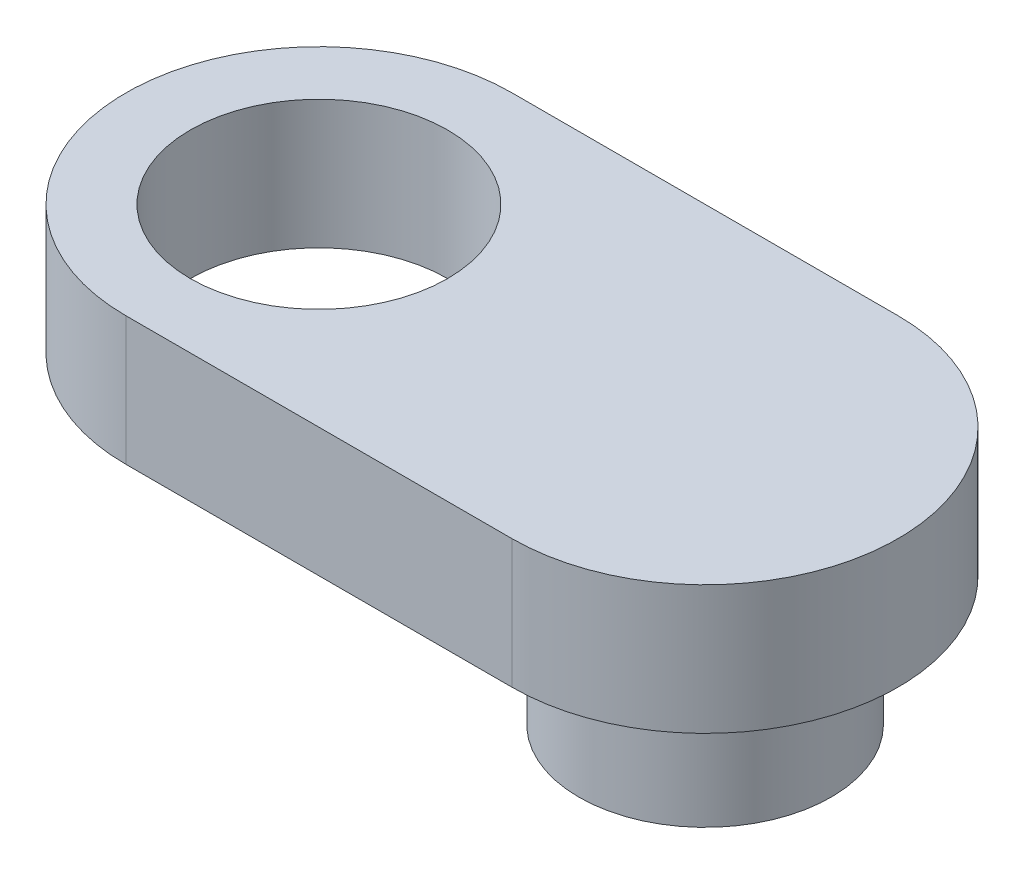
ISO-10303-21;
HEADER;
FILE_DESCRIPTION(('STEP AP214'),'2;1');
FILE_NAME('part.step','',(''),(''),'','','');
FILE_SCHEMA(('AUTOMOTIVE_DESIGN { 1 0 10303 214 1 1 1 1 }'));
ENDSEC;
DATA;
#1=APPLICATION_CONTEXT('core data for automotive mechanical design processes');
#2=APPLICATION_PROTOCOL_DEFINITION('international standard','automotive_design',2000,#1);
#3=PRODUCT_CONTEXT('',#1,'mechanical');
#4=PRODUCT('Part','Part','',(#3));
#5=PRODUCT_RELATED_PRODUCT_CATEGORY('part','',(#4));
#6=PRODUCT_DEFINITION_FORMATION('','',#4);
#7=PRODUCT_DEFINITION_CONTEXT('part definition',#1,'design');
#8=PRODUCT_DEFINITION('design','',#6,#7);
#9=PRODUCT_DEFINITION_SHAPE('','',#8);
#10=(LENGTH_UNIT() NAMED_UNIT(*) SI_UNIT(.MILLI.,.METRE.));
#11=(NAMED_UNIT(*) PLANE_ANGLE_UNIT() SI_UNIT($,.RADIAN.));
#12=(NAMED_UNIT(*) SI_UNIT($,.STERADIAN.) SOLID_ANGLE_UNIT());
#13=UNCERTAINTY_MEASURE_WITH_UNIT(LENGTH_MEASURE(1.E-05),#10,'distance_accuracy_value','');
#14=(GEOMETRIC_REPRESENTATION_CONTEXT(3) GLOBAL_UNCERTAINTY_ASSIGNED_CONTEXT((#13)) GLOBAL_UNIT_ASSIGNED_CONTEXT((#10,
#11,#12)) REPRESENTATION_CONTEXT('',''));
#15=CARTESIAN_POINT('',(0.,0.,0.));
#16=DIRECTION('',(0.,0.,1.));
#17=DIRECTION('',(1.,0.,0.));
#18=AXIS2_PLACEMENT_3D('',#15,#16,#17);
#19=CARTESIAN_POINT('',(15.,5.,-7.5));
#20=DIRECTION('',(0.,-1.,0.));
#21=DIRECTION('',(0.,0.,-1.));
#22=AXIS2_PLACEMENT_3D('',#19,#20,#21);
#23=CYLINDRICAL_SURFACE('',#22,5.);
#24=CARTESIAN_POINT('',(15.,0.,-7.5));
#25=DIRECTION('',(0.,1.,0.));
#26=DIRECTION('',(0.,0.,1.));
#27=AXIS2_PLACEMENT_3D('',#24,#25,#26);
#28=CIRCLE('',#27,5.);
#29=CARTESIAN_POINT('',(15.,0.,-2.5));
#30=VERTEX_POINT('',#29);
#31=EDGE_CURVE('E119',#30,#30,#28,.T.);
#32=ORIENTED_EDGE('',*,*,#31,.F.);
#33=EDGE_LOOP('',(#32));
#34=FACE_BOUND('',#33,.T.);
#35=CARTESIAN_POINT('',(15.,4.,-7.5));
#36=DIRECTION('',(0.,1.,0.));
#37=DIRECTION('',(0.,0.,1.));
#38=AXIS2_PLACEMENT_3D('',#35,#36,#37);
#39=CIRCLE('',#38,5.);
#40=CARTESIAN_POINT('',(15.,4.,-2.5));
#41=VERTEX_POINT('',#40);
#42=EDGE_CURVE('E124',#41,#41,#39,.T.);
#43=ORIENTED_EDGE('',*,*,#42,.T.);
#44=EDGE_LOOP('',(#43));
#45=FACE_BOUND('',#44,.T.);
#46=ADVANCED_FACE('F35',(#34,#45),#23,.F.);
#47=CARTESIAN_POINT('',(0.,5.,-7.5));
#48=DIRECTION('',(0.,1.,0.));
#49=DIRECTION('',(0.,0.,1.));
#50=AXIS2_PLACEMENT_3D('',#47,#48,#49);
#51=PLANE('',#50);
#52=CARTESIAN_POINT('',(0.,5.,-7.5));
#53=DIRECTION('',(0.,1.,0.));
#54=DIRECTION('',(0.,0.,1.));
#55=AXIS2_PLACEMENT_3D('',#52,#53,#54);
#56=CIRCLE('',#55,5.);
#57=CARTESIAN_POINT('',(0.,5.,-2.5));
#58=VERTEX_POINT('',#57);
#59=EDGE_CURVE('E104',#58,#58,#56,.T.);
#60=ORIENTED_EDGE('',*,*,#59,.F.);
#61=EDGE_LOOP('',(#60));
#62=FACE_BOUND('',#61,.T.);
#63=CARTESIAN_POINT('',(0.,5.,-7.5));
#64=DIRECTION('',(0.,1.,0.));
#65=DIRECTION('',(0.,0.,1.));
#66=AXIS2_PLACEMENT_3D('',#63,#64,#65);
#67=CIRCLE('',#66,7.5);
#68=CARTESIAN_POINT('',(0.,5.,-15.));
#69=VERTEX_POINT('',#68);
#70=CARTESIAN_POINT('',(0.,5.,0.));
#71=VERTEX_POINT('',#70);
#72=EDGE_CURVE('E88',#69,#71,#67,.T.);
#73=ORIENTED_EDGE('',*,*,#72,.T.);
#74=DIRECTION('',(1.,0.,0.));
#75=VECTOR('',#74,1.);
#76=CARTESIAN_POINT('',(0.,5.,0.));
#77=LINE('',#76,#75);
#78=CARTESIAN_POINT('',(15.,5.,0.));
#79=VERTEX_POINT('',#78);
#80=EDGE_CURVE('E83',#71,#79,#77,.T.);
#81=ORIENTED_EDGE('',*,*,#80,.T.);
#82=CARTESIAN_POINT('',(15.,5.,-7.5));
#83=DIRECTION('',(0.,1.,0.));
#84=DIRECTION('',(0.,0.,1.));
#85=AXIS2_PLACEMENT_3D('',#82,#83,#84);
#86=CIRCLE('',#85,7.5);
#87=CARTESIAN_POINT('',(15.,5.,-15.));
#88=VERTEX_POINT('',#87);
#89=EDGE_CURVE('E86',#79,#88,#86,.T.);
#90=ORIENTED_EDGE('',*,*,#89,.T.);
#91=DIRECTION('',(-1.,0.,0.));
#92=VECTOR('',#91,1.);
#93=CARTESIAN_POINT('',(0.,5.,-15.));
#94=LINE('',#93,#92);
#95=EDGE_CURVE('E53',#88,#69,#94,.T.);
#96=ORIENTED_EDGE('',*,*,#95,.T.);
#97=EDGE_LOOP('',(#73,#81,#90,#96));
#98=FACE_BOUND('',#97,.T.);
#99=ADVANCED_FACE('F84',(#62,#98),#51,.T.);
#100=CARTESIAN_POINT('',(0.,0.,-7.5));
#101=DIRECTION('',(0.,1.,0.));
#102=DIRECTION('',(0.,0.,1.));
#103=AXIS2_PLACEMENT_3D('',#100,#101,#102);
#104=PLANE('',#103);
#105=CARTESIAN_POINT('',(0.,0.,-7.5));
#106=DIRECTION('',(0.,1.,0.));
#107=DIRECTION('',(0.,0.,1.));
#108=AXIS2_PLACEMENT_3D('',#105,#106,#107);
#109=CIRCLE('',#108,7.5);
#110=CARTESIAN_POINT('',(0.,0.,-15.));
#111=VERTEX_POINT('',#110);
#112=CARTESIAN_POINT('',(0.,0.,0.));
#113=VERTEX_POINT('',#112);
#114=EDGE_CURVE('E101',#111,#113,#109,.T.);
#115=ORIENTED_EDGE('',*,*,#114,.F.);
#116=DIRECTION('',(-1.,0.,0.));
#117=VECTOR('',#116,1.);
#118=CARTESIAN_POINT('',(0.,0.,-15.));
#119=LINE('',#118,#117);
#120=CARTESIAN_POINT('',(15.,0.,-15.));
#121=VERTEX_POINT('',#120);
#122=EDGE_CURVE('E76',#121,#111,#119,.T.);
#123=ORIENTED_EDGE('',*,*,#122,.F.);
#124=CARTESIAN_POINT('',(15.,0.,-7.5));
#125=DIRECTION('',(0.,1.,0.));
#126=DIRECTION('',(0.,0.,1.));
#127=AXIS2_PLACEMENT_3D('',#124,#125,#126);
#128=CIRCLE('',#127,7.5);
#129=CARTESIAN_POINT('',(15.,0.,0.));
#130=VERTEX_POINT('',#129);
#131=EDGE_CURVE('E70',#130,#121,#128,.T.);
#132=ORIENTED_EDGE('',*,*,#131,.F.);
#133=DIRECTION('',(1.,0.,0.));
#134=VECTOR('',#133,1.);
#135=CARTESIAN_POINT('',(0.,0.,0.));
#136=LINE('',#135,#134);
#137=EDGE_CURVE('E92',#113,#130,#136,.T.);
#138=ORIENTED_EDGE('',*,*,#137,.F.);
#139=EDGE_LOOP('',(#115,#123,#132,#138));
#140=FACE_BOUND('',#139,.T.);
#141=CARTESIAN_POINT('',(0.,0.,-7.5));
#142=DIRECTION('',(0.,1.,0.));
#143=DIRECTION('',(0.,0.,1.));
#144=AXIS2_PLACEMENT_3D('',#141,#142,#143);
#145=CIRCLE('',#144,5.);
#146=CARTESIAN_POINT('',(0.,0.,-2.5));
#147=VERTEX_POINT('',#146);
#148=EDGE_CURVE('E116',#147,#147,#145,.T.);
#149=ORIENTED_EDGE('',*,*,#148,.T.);
#150=EDGE_LOOP('',(#149));
#151=FACE_BOUND('',#150,.T.);
#152=ORIENTED_EDGE('',*,*,#31,.T.);
#153=EDGE_LOOP('',(#152));
#154=FACE_BOUND('',#153,.T.);
#155=ADVANCED_FACE('F112',(#140,#151,#154),#104,.F.);
#156=CARTESIAN_POINT('',(0.,5.,-7.5));
#157=DIRECTION('',(0.,-1.,0.));
#158=DIRECTION('',(0.,0.,-1.));
#159=AXIS2_PLACEMENT_3D('',#156,#157,#158);
#160=CYLINDRICAL_SURFACE('',#159,7.5);
#161=ORIENTED_EDGE('',*,*,#114,.T.);
#162=DIRECTION('',(0.,-1.,0.));
#163=VECTOR('',#162,1.);
#164=CARTESIAN_POINT('',(0.,5.,0.));
#165=LINE('',#164,#163);
#166=EDGE_CURVE('E11',#71,#113,#165,.T.);
#167=ORIENTED_EDGE('',*,*,#166,.F.);
#168=ORIENTED_EDGE('',*,*,#72,.F.);
#169=DIRECTION('',(0.,-1.,0.));
#170=VECTOR('',#169,1.);
#171=CARTESIAN_POINT('',(0.,5.,-15.));
#172=LINE('',#171,#170);
#173=EDGE_CURVE('E97',#69,#111,#172,.T.);
#174=ORIENTED_EDGE('',*,*,#173,.T.);
#175=EDGE_LOOP('',(#161,#167,#168,#174));
#176=FACE_BOUND('',#175,.T.);
#177=ADVANCED_FACE('F37',(#176),#160,.T.);
#178=CARTESIAN_POINT('',(0.,5.,0.));
#179=DIRECTION('',(0.,0.,-1.));
#180=DIRECTION('',(-1.,0.,0.));
#181=AXIS2_PLACEMENT_3D('',#178,#179,#180);
#182=PLANE('',#181);
#183=ORIENTED_EDGE('',*,*,#137,.T.);
#184=DIRECTION('',(0.,-1.,0.));
#185=VECTOR('',#184,1.);
#186=CARTESIAN_POINT('',(15.,5.,0.));
#187=LINE('',#186,#185);
#188=EDGE_CURVE('E45',#79,#130,#187,.T.);
#189=ORIENTED_EDGE('',*,*,#188,.F.);
#190=ORIENTED_EDGE('',*,*,#80,.F.);
#191=ORIENTED_EDGE('',*,*,#166,.T.);
#192=EDGE_LOOP('',(#183,#189,#190,#191));
#193=FACE_BOUND('',#192,.T.);
#194=ADVANCED_FACE('F91',(#193),#182,.F.);
#195=CARTESIAN_POINT('',(15.,5.,-7.5));
#196=DIRECTION('',(0.,-1.,0.));
#197=DIRECTION('',(0.,0.,-1.));
#198=AXIS2_PLACEMENT_3D('',#195,#196,#197);
#199=CYLINDRICAL_SURFACE('',#198,7.5);
#200=ORIENTED_EDGE('',*,*,#131,.T.);
#201=DIRECTION('',(0.,-1.,0.));
#202=VECTOR('',#201,1.);
#203=CARTESIAN_POINT('',(15.,5.,-15.));
#204=LINE('',#203,#202);
#205=EDGE_CURVE('E93',#88,#121,#204,.T.);
#206=ORIENTED_EDGE('',*,*,#205,.F.);
#207=ORIENTED_EDGE('',*,*,#89,.F.);
#208=ORIENTED_EDGE('',*,*,#188,.T.);
#209=EDGE_LOOP('',(#200,#206,#207,#208));
#210=FACE_BOUND('',#209,.T.);
#211=ADVANCED_FACE('F95',(#210),#199,.T.);
#212=CARTESIAN_POINT('',(0.,5.,-15.));
#213=DIRECTION('',(0.,0.,1.));
#214=DIRECTION('',(1.,0.,0.));
#215=AXIS2_PLACEMENT_3D('',#212,#213,#214);
#216=PLANE('',#215);
#217=ORIENTED_EDGE('',*,*,#122,.T.);
#218=ORIENTED_EDGE('',*,*,#173,.F.);
#219=ORIENTED_EDGE('',*,*,#95,.F.);
#220=ORIENTED_EDGE('',*,*,#205,.T.);
#221=EDGE_LOOP('',(#217,#218,#219,#220));
#222=FACE_BOUND('',#221,.T.);
#223=ADVANCED_FACE('F109',(#222),#216,.F.);
#224=CARTESIAN_POINT('',(0.,5.,-7.5));
#225=DIRECTION('',(0.,-1.,0.));
#226=DIRECTION('',(0.,0.,-1.));
#227=AXIS2_PLACEMENT_3D('',#224,#225,#226);
#228=CYLINDRICAL_SURFACE('',#227,5.);
#229=ORIENTED_EDGE('',*,*,#59,.T.);
#230=EDGE_LOOP('',(#229));
#231=FACE_BOUND('',#230,.T.);
#232=ORIENTED_EDGE('',*,*,#148,.F.);
#233=EDGE_LOOP('',(#232));
#234=FACE_BOUND('',#233,.T.);
#235=ADVANCED_FACE('F147',(#231,#234),#228,.F.);
#236=CARTESIAN_POINT('',(15.,4.,-7.5));
#237=DIRECTION('',(0.,1.,0.));
#238=DIRECTION('',(0.,0.,1.));
#239=AXIS2_PLACEMENT_3D('',#236,#237,#238);
#240=PLANE('',#239);
#241=CARTESIAN_POINT('',(15.,4.,-7.5));
#242=DIRECTION('',(0.,1.,0.));
#243=DIRECTION('',(0.,0.,1.));
#244=AXIS2_PLACEMENT_3D('',#241,#242,#243);
#245=CIRCLE('',#244,4.9);
#246=CARTESIAN_POINT('',(15.,4.,-2.6));
#247=VERTEX_POINT('',#246);
#248=EDGE_CURVE('E39',#247,#247,#245,.T.);
#249=ORIENTED_EDGE('',*,*,#248,.T.);
#250=EDGE_LOOP('',(#249));
#251=FACE_BOUND('',#250,.T.);
#252=ORIENTED_EDGE('',*,*,#42,.F.);
#253=EDGE_LOOP('',(#252));
#254=FACE_BOUND('',#253,.T.);
#255=ADVANCED_FACE('F134',(#251,#254),#240,.F.);
#256=CARTESIAN_POINT('',(15.,-5.,-7.5));
#257=DIRECTION('',(0.,1.,0.));
#258=DIRECTION('',(0.,0.,1.));
#259=AXIS2_PLACEMENT_3D('',#256,#257,#258);
#260=CYLINDRICAL_SURFACE('',#259,4.9);
#261=CARTESIAN_POINT('',(15.,-5.,-7.5));
#262=DIRECTION('',(0.,1.,0.));
#263=DIRECTION('',(0.,0.,1.));
#264=AXIS2_PLACEMENT_3D('',#261,#262,#263);
#265=CIRCLE('',#264,4.9);
#266=CARTESIAN_POINT('',(15.,-5.,-2.6));
#267=VERTEX_POINT('',#266);
#268=EDGE_CURVE('E127',#267,#267,#265,.T.);
#269=ORIENTED_EDGE('',*,*,#268,.T.);
#270=EDGE_LOOP('',(#269));
#271=FACE_BOUND('',#270,.T.);
#272=ORIENTED_EDGE('',*,*,#248,.F.);
#273=EDGE_LOOP('',(#272));
#274=FACE_BOUND('',#273,.T.);
#275=ADVANCED_FACE('F137',(#271,#274),#260,.T.);
#276=CARTESIAN_POINT('',(15.,-5.,-7.5));
#277=DIRECTION('',(0.,1.,0.));
#278=DIRECTION('',(0.,0.,1.));
#279=AXIS2_PLACEMENT_3D('',#276,#277,#278);
#280=PLANE('',#279);
#281=ORIENTED_EDGE('',*,*,#268,.F.);
#282=EDGE_LOOP('',(#281));
#283=FACE_BOUND('',#282,.T.);
#284=ADVANCED_FACE('F139',(#283),#280,.F.);
#285=CLOSED_SHELL('',(#46,#99,#155,#177,#194,#211,#223,#235,#255,#275,#284));
#286=MANIFOLD_SOLID_BREP('B2',#285);
#287=ADVANCED_BREP_SHAPE_REPRESENTATION('',(#18,#286),#14);
#288=SHAPE_DEFINITION_REPRESENTATION(#9,#287);
ENDSEC;
END-ISO-10303-21;
